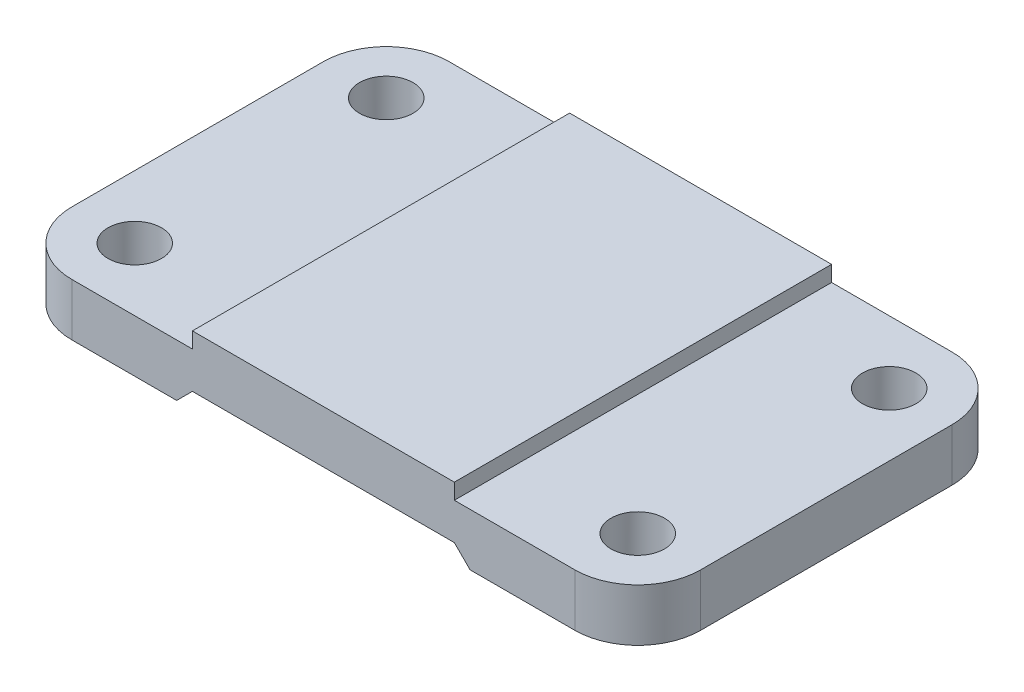
ISO-10303-21;
HEADER;
FILE_DESCRIPTION(('STEP AP214'),'2;1');
FILE_NAME('part.step','',(''),(''),'','','');
FILE_SCHEMA(('AUTOMOTIVE_DESIGN { 1 0 10303 214 1 1 1 1 }'));
ENDSEC;
DATA;
#1=APPLICATION_CONTEXT('core data for automotive mechanical design processes');
#2=APPLICATION_PROTOCOL_DEFINITION('international standard','automotive_design',2000,#1);
#3=PRODUCT_CONTEXT('',#1,'mechanical');
#4=PRODUCT('Part','Part','',(#3));
#5=PRODUCT_RELATED_PRODUCT_CATEGORY('part','',(#4));
#6=PRODUCT_DEFINITION_FORMATION('','',#4);
#7=PRODUCT_DEFINITION_CONTEXT('part definition',#1,'design');
#8=PRODUCT_DEFINITION('design','',#6,#7);
#9=PRODUCT_DEFINITION_SHAPE('','',#8);
#10=(LENGTH_UNIT() NAMED_UNIT(*) SI_UNIT(.MILLI.,.METRE.));
#11=(NAMED_UNIT(*) PLANE_ANGLE_UNIT() SI_UNIT($,.RADIAN.));
#12=(NAMED_UNIT(*) SI_UNIT($,.STERADIAN.) SOLID_ANGLE_UNIT());
#13=UNCERTAINTY_MEASURE_WITH_UNIT(LENGTH_MEASURE(1.E-05),#10,'distance_accuracy_value','');
#14=(GEOMETRIC_REPRESENTATION_CONTEXT(3) GLOBAL_UNCERTAINTY_ASSIGNED_CONTEXT((#13)) GLOBAL_UNIT_ASSIGNED_CONTEXT((#10,
#11,#12)) REPRESENTATION_CONTEXT('',''));
#15=CARTESIAN_POINT('',(0.,0.,0.));
#16=DIRECTION('',(0.,0.,1.));
#17=DIRECTION('',(1.,0.,0.));
#18=AXIS2_PLACEMENT_3D('',#15,#16,#17);
#19=CARTESIAN_POINT('',(-25.,10.,-36.));
#20=DIRECTION('',(1.,0.,0.));
#21=DIRECTION('',(0.,0.,-1.));
#22=AXIS2_PLACEMENT_3D('',#19,#20,#21);
#23=PLANE('',#22);
#24=DIRECTION('',(0.,0.,-1.));
#25=VECTOR('',#24,1.);
#26=CARTESIAN_POINT('',(-25.,7.,36.));
#27=LINE('',#26,#25);
#28=CARTESIAN_POINT('',(-25.,7.,36.));
#29=VERTEX_POINT('',#28);
#30=CARTESIAN_POINT('',(-25.,7.,-36.));
#31=VERTEX_POINT('',#30);
#32=EDGE_CURVE('E211',#29,#31,#27,.T.);
#33=ORIENTED_EDGE('',*,*,#32,.F.);
#34=DIRECTION('',(0.,-1.,0.));
#35=VECTOR('',#34,1.);
#36=CARTESIAN_POINT('',(-25.,10.,36.));
#37=LINE('',#36,#35);
#38=CARTESIAN_POINT('',(-25.,10.,36.));
#39=VERTEX_POINT('',#38);
#40=EDGE_CURVE('E263',#39,#29,#37,.T.);
#41=ORIENTED_EDGE('',*,*,#40,.F.);
#42=DIRECTION('',(0.,0.,1.));
#43=VECTOR('',#42,1.);
#44=CARTESIAN_POINT('',(-25.,10.,-36.));
#45=LINE('',#44,#43);
#46=CARTESIAN_POINT('',(-25.,10.,-36.));
#47=VERTEX_POINT('',#46);
#48=EDGE_CURVE('E260',#47,#39,#45,.T.);
#49=ORIENTED_EDGE('',*,*,#48,.F.);
#50=DIRECTION('',(0.,-1.,0.));
#51=VECTOR('',#50,1.);
#52=CARTESIAN_POINT('',(-25.,10.,-36.));
#53=LINE('',#52,#51);
#54=EDGE_CURVE('E278',#47,#31,#53,.T.);
#55=ORIENTED_EDGE('',*,*,#54,.T.);
#56=EDGE_LOOP('',(#33,#41,#49,#55));
#57=FACE_BOUND('',#56,.T.);
#58=ADVANCED_FACE('F45',(#57),#23,.F.);
#59=CARTESIAN_POINT('',(-25.,10.,36.));
#60=DIRECTION('',(0.,0.,-1.));
#61=DIRECTION('',(-1.,0.,0.));
#62=AXIS2_PLACEMENT_3D('',#59,#60,#61);
#63=PLANE('',#62);
#64=DIRECTION('',(1.,0.,0.));
#65=VECTOR('',#64,1.);
#66=CARTESIAN_POINT('',(60.,-3.00000000000001,36.));
#67=LINE('',#66,#65);
#68=CARTESIAN_POINT('',(28.,-3.00000000000001,36.));
#69=VERTEX_POINT('',#68);
#70=CARTESIAN_POINT('',(48.,-3.00000000000001,36.));
#71=VERTEX_POINT('',#70);
#72=EDGE_CURVE('E245',#69,#71,#67,.T.);
#73=ORIENTED_EDGE('',*,*,#72,.T.);
#74=DIRECTION('',(0.,1.,0.));
#75=VECTOR('',#74,1.);
#76=CARTESIAN_POINT('',(48.,10.,36.));
#77=LINE('',#76,#75);
#78=CARTESIAN_POINT('',(48.,7.,36.));
#79=VERTEX_POINT('',#78);
#80=EDGE_CURVE('E11',#71,#79,#77,.T.);
#81=ORIENTED_EDGE('',*,*,#80,.T.);
#82=DIRECTION('',(-1.,0.,0.));
#83=VECTOR('',#82,1.);
#84=CARTESIAN_POINT('',(25.,7.,36.));
#85=LINE('',#84,#83);
#86=CARTESIAN_POINT('',(25.,7.,36.));
#87=VERTEX_POINT('',#86);
#88=EDGE_CURVE('E233',#79,#87,#85,.T.);
#89=ORIENTED_EDGE('',*,*,#88,.T.);
#90=DIRECTION('',(0.,-1.,0.));
#91=VECTOR('',#90,1.);
#92=CARTESIAN_POINT('',(25.,10.,36.));
#93=LINE('',#92,#91);
#94=CARTESIAN_POINT('',(25.,10.,36.));
#95=VERTEX_POINT('',#94);
#96=EDGE_CURVE('E285',#95,#87,#93,.T.);
#97=ORIENTED_EDGE('',*,*,#96,.F.);
#98=DIRECTION('',(1.,0.,0.));
#99=VECTOR('',#98,1.);
#100=CARTESIAN_POINT('',(-25.,10.,36.));
#101=LINE('',#100,#99);
#102=EDGE_CURVE('E250',#39,#95,#101,.T.);
#103=ORIENTED_EDGE('',*,*,#102,.F.);
#104=ORIENTED_EDGE('',*,*,#40,.T.);
#105=DIRECTION('',(-1.,0.,0.));
#106=VECTOR('',#105,1.);
#107=CARTESIAN_POINT('',(-25.,7.,36.));
#108=LINE('',#107,#106);
#109=CARTESIAN_POINT('',(-48.,7.,36.));
#110=VERTEX_POINT('',#109);
#111=EDGE_CURVE('E176',#29,#110,#108,.T.);
#112=ORIENTED_EDGE('',*,*,#111,.T.);
#113=DIRECTION('',(0.,-1.,0.));
#114=VECTOR('',#113,1.);
#115=CARTESIAN_POINT('',(-48.,10.,36.));
#116=LINE('',#115,#114);
#117=CARTESIAN_POINT('',(-48.,-3.00000000000001,36.));
#118=VERTEX_POINT('',#117);
#119=EDGE_CURVE('E173',#110,#118,#116,.T.);
#120=ORIENTED_EDGE('',*,*,#119,.T.);
#121=DIRECTION('',(1.,0.,0.));
#122=VECTOR('',#121,1.);
#123=CARTESIAN_POINT('',(-60.,-3.00000000000001,36.));
#124=LINE('',#123,#122);
#125=CARTESIAN_POINT('',(-28.,-3.00000000000001,36.));
#126=VERTEX_POINT('',#125);
#127=EDGE_CURVE('E164',#118,#126,#124,.T.);
#128=ORIENTED_EDGE('',*,*,#127,.T.);
#129=DIRECTION('',(0.707106781186546,0.707106781186549,0.));
#130=VECTOR('',#129,1.);
#131=CARTESIAN_POINT('',(-28.,-3.00000000000001,36.));
#132=LINE('',#131,#130);
#133=CARTESIAN_POINT('',(-25.,0.,36.));
#134=VERTEX_POINT('',#133);
#135=EDGE_CURVE('E169',#126,#134,#132,.T.);
#136=ORIENTED_EDGE('',*,*,#135,.T.);
#137=DIRECTION('',(1.,0.,0.));
#138=VECTOR('',#137,1.);
#139=CARTESIAN_POINT('',(-25.,0.,36.));
#140=LINE('',#139,#138);
#141=CARTESIAN_POINT('',(25.,0.,36.));
#142=VERTEX_POINT('',#141);
#143=EDGE_CURVE('E215',#134,#142,#140,.T.);
#144=ORIENTED_EDGE('',*,*,#143,.T.);
#145=DIRECTION('',(0.707106781186547,-0.707106781186548,0.));
#146=VECTOR('',#145,1.);
#147=CARTESIAN_POINT('',(25.,0.,36.));
#148=LINE('',#147,#146);
#149=EDGE_CURVE('E238',#142,#69,#148,.T.);
#150=ORIENTED_EDGE('',*,*,#149,.T.);
#151=EDGE_LOOP('',(#73,#81,#89,#97,#103,#104,#112,#120,#128,#136,#144,#150));
#152=FACE_BOUND('',#151,.T.);
#153=ADVANCED_FACE('F166',(#152),#63,.F.);
#154=CARTESIAN_POINT('',(25.,10.,36.));
#155=DIRECTION('',(-1.,0.,0.));
#156=DIRECTION('',(0.,0.,1.));
#157=AXIS2_PLACEMENT_3D('',#154,#155,#156);
#158=PLANE('',#157);
#159=ORIENTED_EDGE('',*,*,#96,.T.);
#160=DIRECTION('',(0.,0.,-1.));
#161=VECTOR('',#160,1.);
#162=CARTESIAN_POINT('',(25.,7.,36.));
#163=LINE('',#162,#161);
#164=CARTESIAN_POINT('',(25.,7.,-36.));
#165=VERTEX_POINT('',#164);
#166=EDGE_CURVE('E229',#87,#165,#163,.T.);
#167=ORIENTED_EDGE('',*,*,#166,.T.);
#168=DIRECTION('',(0.,-1.,0.));
#169=VECTOR('',#168,1.);
#170=CARTESIAN_POINT('',(25.,10.,-36.));
#171=LINE('',#170,#169);
#172=CARTESIAN_POINT('',(25.,10.,-36.));
#173=VERTEX_POINT('',#172);
#174=EDGE_CURVE('E281',#173,#165,#171,.T.);
#175=ORIENTED_EDGE('',*,*,#174,.F.);
#176=DIRECTION('',(0.,0.,-1.));
#177=VECTOR('',#176,1.);
#178=CARTESIAN_POINT('',(25.,10.,36.));
#179=LINE('',#178,#177);
#180=EDGE_CURVE('E254',#95,#173,#179,.T.);
#181=ORIENTED_EDGE('',*,*,#180,.F.);
#182=EDGE_LOOP('',(#159,#167,#175,#181));
#183=FACE_BOUND('',#182,.T.);
#184=ADVANCED_FACE('F367',(#183),#158,.F.);
#185=CARTESIAN_POINT('',(25.,10.,-36.));
#186=DIRECTION('',(0.,0.,1.));
#187=DIRECTION('',(1.,0.,0.));
#188=AXIS2_PLACEMENT_3D('',#185,#186,#187);
#189=PLANE('',#188);
#190=DIRECTION('',(-1.,0.,0.));
#191=VECTOR('',#190,1.);
#192=CARTESIAN_POINT('',(25.,7.,-36.));
#193=LINE('',#192,#191);
#194=CARTESIAN_POINT('',(48.,7.,-36.));
#195=VERTEX_POINT('',#194);
#196=EDGE_CURVE('E234',#195,#165,#193,.T.);
#197=ORIENTED_EDGE('',*,*,#196,.F.);
#198=DIRECTION('',(0.,1.,0.));
#199=VECTOR('',#198,1.);
#200=CARTESIAN_POINT('',(48.,10.,-36.));
#201=LINE('',#200,#199);
#202=CARTESIAN_POINT('',(48.,-3.00000000000001,-36.));
#203=VERTEX_POINT('',#202);
#204=EDGE_CURVE('E69',#195,#203,#201,.F.);
#205=ORIENTED_EDGE('',*,*,#204,.T.);
#206=DIRECTION('',(1.,0.,0.));
#207=VECTOR('',#206,1.);
#208=CARTESIAN_POINT('',(60.,-3.00000000000001,-36.));
#209=LINE('',#208,#207);
#210=CARTESIAN_POINT('',(28.,-3.00000000000001,-36.));
#211=VERTEX_POINT('',#210);
#212=EDGE_CURVE('E237',#211,#203,#209,.T.);
#213=ORIENTED_EDGE('',*,*,#212,.F.);
#214=DIRECTION('',(0.707106781186547,-0.707106781186548,0.));
#215=VECTOR('',#214,1.);
#216=CARTESIAN_POINT('',(25.,0.,-36.));
#217=LINE('',#216,#215);
#218=CARTESIAN_POINT('',(25.,0.,-36.));
#219=VERTEX_POINT('',#218);
#220=EDGE_CURVE('E200',#219,#211,#217,.T.);
#221=ORIENTED_EDGE('',*,*,#220,.F.);
#222=DIRECTION('',(-1.,0.,0.));
#223=VECTOR('',#222,1.);
#224=CARTESIAN_POINT('',(25.,0.,-36.));
#225=LINE('',#224,#223);
#226=CARTESIAN_POINT('',(-25.,0.,-36.));
#227=VERTEX_POINT('',#226);
#228=EDGE_CURVE('E270',#219,#227,#225,.T.);
#229=ORIENTED_EDGE('',*,*,#228,.T.);
#230=DIRECTION('',(0.707106781186546,0.707106781186549,0.));
#231=VECTOR('',#230,1.);
#232=CARTESIAN_POINT('',(-28.,-3.00000000000001,-36.));
#233=LINE('',#232,#231);
#234=CARTESIAN_POINT('',(-28.,-3.00000000000001,-36.));
#235=VERTEX_POINT('',#234);
#236=EDGE_CURVE('E203',#235,#227,#233,.T.);
#237=ORIENTED_EDGE('',*,*,#236,.F.);
#238=DIRECTION('',(1.,0.,0.));
#239=VECTOR('',#238,1.);
#240=CARTESIAN_POINT('',(-60.,-3.00000000000001,-36.));
#241=LINE('',#240,#239);
#242=CARTESIAN_POINT('',(-48.,-3.00000000000001,-36.));
#243=VERTEX_POINT('',#242);
#244=EDGE_CURVE('E182',#243,#235,#241,.T.);
#245=ORIENTED_EDGE('',*,*,#244,.F.);
#246=DIRECTION('',(0.,-1.,0.));
#247=VECTOR('',#246,1.);
#248=CARTESIAN_POINT('',(-48.,10.,-36.));
#249=LINE('',#248,#247);
#250=CARTESIAN_POINT('',(-48.,7.,-36.));
#251=VERTEX_POINT('',#250);
#252=EDGE_CURVE('E315',#243,#251,#249,.F.);
#253=ORIENTED_EDGE('',*,*,#252,.T.);
#254=DIRECTION('',(-1.,0.,0.));
#255=VECTOR('',#254,1.);
#256=CARTESIAN_POINT('',(-25.,7.,-36.));
#257=LINE('',#256,#255);
#258=EDGE_CURVE('E196',#31,#251,#257,.T.);
#259=ORIENTED_EDGE('',*,*,#258,.F.);
#260=ORIENTED_EDGE('',*,*,#54,.F.);
#261=DIRECTION('',(-1.,0.,0.));
#262=VECTOR('',#261,1.);
#263=CARTESIAN_POINT('',(25.,10.,-36.));
#264=LINE('',#263,#262);
#265=EDGE_CURVE('E257',#173,#47,#264,.T.);
#266=ORIENTED_EDGE('',*,*,#265,.F.);
#267=ORIENTED_EDGE('',*,*,#174,.T.);
#268=EDGE_LOOP('',(#197,#205,#213,#221,#229,#237,#245,#253,#259,#260,#266,#267));
#269=FACE_BOUND('',#268,.T.);
#270=ADVANCED_FACE('F362',(#269),#189,.F.);
#271=CARTESIAN_POINT('',(0.,10.,0.));
#272=DIRECTION('',(0.,1.,0.));
#273=DIRECTION('',(0.,0.,1.));
#274=AXIS2_PLACEMENT_3D('',#271,#272,#273);
#275=PLANE('',#274);
#276=ORIENTED_EDGE('',*,*,#102,.T.);
#277=ORIENTED_EDGE('',*,*,#180,.T.);
#278=ORIENTED_EDGE('',*,*,#265,.T.);
#279=ORIENTED_EDGE('',*,*,#48,.T.);
#280=EDGE_LOOP('',(#276,#277,#278,#279));
#281=FACE_BOUND('',#280,.T.);
#282=ADVANCED_FACE('F393',(#281),#275,.T.);
#283=CARTESIAN_POINT('',(0.,0.,0.));
#284=DIRECTION('',(0.,1.,0.));
#285=DIRECTION('',(0.,0.,1.));
#286=AXIS2_PLACEMENT_3D('',#283,#284,#285);
#287=PLANE('',#286);
#288=ORIENTED_EDGE('',*,*,#143,.F.);
#289=DIRECTION('',(0.,0.,1.));
#290=VECTOR('',#289,1.);
#291=CARTESIAN_POINT('',(-25.,0.,-36.));
#292=LINE('',#291,#290);
#293=EDGE_CURVE('E191',#227,#134,#292,.T.);
#294=ORIENTED_EDGE('',*,*,#293,.F.);
#295=ORIENTED_EDGE('',*,*,#228,.F.);
#296=DIRECTION('',(0.,0.,-1.));
#297=VECTOR('',#296,1.);
#298=CARTESIAN_POINT('',(25.,0.,36.));
#299=LINE('',#298,#297);
#300=EDGE_CURVE('E266',#142,#219,#299,.T.);
#301=ORIENTED_EDGE('',*,*,#300,.F.);
#302=EDGE_LOOP('',(#288,#294,#295,#301));
#303=FACE_BOUND('',#302,.T.);
#304=ADVANCED_FACE('F389',(#303),#287,.F.);
#305=CARTESIAN_POINT('',(-25.,7.,36.));
#306=DIRECTION('',(0.,-1.,0.));
#307=DIRECTION('',(1.,0.,0.));
#308=AXIS2_PLACEMENT_3D('',#305,#306,#307);
#309=PLANE('',#308);
#310=CARTESIAN_POINT('',(-48.,7.,24.));
#311=DIRECTION('',(0.,-1.,0.));
#312=DIRECTION('',(1.,0.,0.));
#313=AXIS2_PLACEMENT_3D('',#310,#311,#312);
#314=CIRCLE('',#313,5.1);
#315=CARTESIAN_POINT('',(-42.9,7.,24.));
#316=VERTEX_POINT('',#315);
#317=EDGE_CURVE('E221',#316,#316,#314,.T.);
#318=ORIENTED_EDGE('',*,*,#317,.T.);
#319=EDGE_LOOP('',(#318));
#320=FACE_BOUND('',#319,.T.);
#321=CARTESIAN_POINT('',(-48.,7.,-24.));
#322=DIRECTION('',(0.,-1.,0.));
#323=DIRECTION('',(1.,0.,0.));
#324=AXIS2_PLACEMENT_3D('',#321,#322,#323);
#325=CIRCLE('',#324,5.1);
#326=CARTESIAN_POINT('',(-42.9,7.,-24.));
#327=VERTEX_POINT('',#326);
#328=EDGE_CURVE('E304',#327,#327,#325,.T.);
#329=ORIENTED_EDGE('',*,*,#328,.T.);
#330=EDGE_LOOP('',(#329));
#331=FACE_BOUND('',#330,.T.);
#332=DIRECTION('',(0.,0.,-1.));
#333=VECTOR('',#332,1.);
#334=CARTESIAN_POINT('',(-60.,7.,36.));
#335=LINE('',#334,#333);
#336=CARTESIAN_POINT('',(-60.,7.,24.));
#337=VERTEX_POINT('',#336);
#338=CARTESIAN_POINT('',(-60.,7.,-24.));
#339=VERTEX_POINT('',#338);
#340=EDGE_CURVE('E208',#337,#339,#335,.T.);
#341=ORIENTED_EDGE('',*,*,#340,.F.);
#342=CARTESIAN_POINT('',(-48.,7.,24.));
#343=DIRECTION('',(0.,-1.,0.));
#344=DIRECTION('',(1.,0.,0.));
#345=AXIS2_PLACEMENT_3D('',#342,#343,#344);
#346=CIRCLE('',#345,12.);
#347=EDGE_CURVE('E330',#337,#110,#346,.F.);
#348=ORIENTED_EDGE('',*,*,#347,.T.);
#349=ORIENTED_EDGE('',*,*,#111,.F.);
#350=ORIENTED_EDGE('',*,*,#32,.T.);
#351=ORIENTED_EDGE('',*,*,#258,.T.);
#352=CARTESIAN_POINT('',(-48.,7.,-24.));
#353=DIRECTION('',(0.,-1.,0.));
#354=DIRECTION('',(1.,0.,0.));
#355=AXIS2_PLACEMENT_3D('',#352,#353,#354);
#356=CIRCLE('',#355,12.);
#357=EDGE_CURVE('E318',#251,#339,#356,.F.);
#358=ORIENTED_EDGE('',*,*,#357,.T.);
#359=EDGE_LOOP('',(#341,#348,#349,#350,#351,#358));
#360=FACE_BOUND('',#359,.T.);
#361=ADVANCED_FACE('F410',(#320,#331,#360),#309,.F.);
#362=CARTESIAN_POINT('',(-60.,7.,36.));
#363=DIRECTION('',(1.,0.,0.));
#364=DIRECTION('',(0.,0.,-1.));
#365=AXIS2_PLACEMENT_3D('',#362,#363,#364);
#366=PLANE('',#365);
#367=DIRECTION('',(0.,0.,-1.));
#368=VECTOR('',#367,1.);
#369=CARTESIAN_POINT('',(-60.,-3.00000000000001,36.));
#370=LINE('',#369,#368);
#371=CARTESIAN_POINT('',(-60.,-3.00000000000001,24.));
#372=VERTEX_POINT('',#371);
#373=CARTESIAN_POINT('',(-60.,-3.00000000000001,-24.));
#374=VERTEX_POINT('',#373);
#375=EDGE_CURVE('E187',#372,#374,#370,.T.);
#376=ORIENTED_EDGE('',*,*,#375,.F.);
#377=DIRECTION('',(0.,-1.,0.));
#378=VECTOR('',#377,1.);
#379=CARTESIAN_POINT('',(-60.,7.,24.));
#380=LINE('',#379,#378);
#381=EDGE_CURVE('E327',#372,#337,#380,.F.);
#382=ORIENTED_EDGE('',*,*,#381,.T.);
#383=ORIENTED_EDGE('',*,*,#340,.T.);
#384=DIRECTION('',(0.,-1.,0.));
#385=VECTOR('',#384,1.);
#386=CARTESIAN_POINT('',(-60.,7.,-24.));
#387=LINE('',#386,#385);
#388=EDGE_CURVE('E289',#339,#374,#387,.T.);
#389=ORIENTED_EDGE('',*,*,#388,.T.);
#390=EDGE_LOOP('',(#376,#382,#383,#389));
#391=FACE_BOUND('',#390,.T.);
#392=ADVANCED_FACE('F455',(#391),#366,.F.);
#393=CARTESIAN_POINT('',(-60.,-3.00000000000001,36.));
#394=DIRECTION('',(0.,1.,0.));
#395=DIRECTION('',(-1.,0.,0.));
#396=AXIS2_PLACEMENT_3D('',#393,#394,#395);
#397=PLANE('',#396);
#398=CARTESIAN_POINT('',(-48.,-3.,24.));
#399=DIRECTION('',(0.,1.,0.));
#400=DIRECTION('',(-1.,0.,0.));
#401=AXIS2_PLACEMENT_3D('',#398,#399,#400);
#402=CIRCLE('',#401,5.1);
#403=CARTESIAN_POINT('',(-53.1,-3.,24.));
#404=VERTEX_POINT('',#403);
#405=EDGE_CURVE('E305',#404,#404,#402,.T.);
#406=ORIENTED_EDGE('',*,*,#405,.T.);
#407=EDGE_LOOP('',(#406));
#408=FACE_BOUND('',#407,.T.);
#409=CARTESIAN_POINT('',(-48.,-3.,-24.));
#410=DIRECTION('',(0.,1.,0.));
#411=DIRECTION('',(-1.,0.,0.));
#412=AXIS2_PLACEMENT_3D('',#409,#410,#411);
#413=CIRCLE('',#412,5.1);
#414=CARTESIAN_POINT('',(-53.1,-3.,-24.));
#415=VERTEX_POINT('',#414);
#416=EDGE_CURVE('E300',#415,#415,#413,.T.);
#417=ORIENTED_EDGE('',*,*,#416,.T.);
#418=EDGE_LOOP('',(#417));
#419=FACE_BOUND('',#418,.T.);
#420=ORIENTED_EDGE('',*,*,#127,.F.);
#421=CARTESIAN_POINT('',(-48.,-3.,24.));
#422=DIRECTION('',(0.,1.,0.));
#423=DIRECTION('',(-1.,0.,0.));
#424=AXIS2_PLACEMENT_3D('',#421,#422,#423);
#425=CIRCLE('',#424,12.);
#426=EDGE_CURVE('E324',#118,#372,#425,.F.);
#427=ORIENTED_EDGE('',*,*,#426,.T.);
#428=ORIENTED_EDGE('',*,*,#375,.T.);
#429=CARTESIAN_POINT('',(-48.,-3.00000000000001,-24.));
#430=DIRECTION('',(0.,1.,0.));
#431=DIRECTION('',(-1.,0.,0.));
#432=AXIS2_PLACEMENT_3D('',#429,#430,#431);
#433=CIRCLE('',#432,12.);
#434=EDGE_CURVE('E312',#374,#243,#433,.F.);
#435=ORIENTED_EDGE('',*,*,#434,.T.);
#436=ORIENTED_EDGE('',*,*,#244,.T.);
#437=DIRECTION('',(0.,0.,-1.));
#438=VECTOR('',#437,1.);
#439=CARTESIAN_POINT('',(-28.,-3.00000000000001,36.));
#440=LINE('',#439,#438);
#441=EDGE_CURVE('E179',#126,#235,#440,.T.);
#442=ORIENTED_EDGE('',*,*,#441,.F.);
#443=EDGE_LOOP('',(#420,#427,#428,#435,#436,#442));
#444=FACE_BOUND('',#443,.T.);
#445=ADVANCED_FACE('F180',(#408,#419,#444),#397,.F.);
#446=CARTESIAN_POINT('',(-28.,-3.00000000000001,36.));
#447=DIRECTION('',(-0.707106781186549,0.707106781186546,0.));
#448=DIRECTION('',(-0.707106781186546,-0.707106781186549,0.));
#449=AXIS2_PLACEMENT_3D('',#446,#447,#448);
#450=PLANE('',#449);
#451=ORIENTED_EDGE('',*,*,#236,.T.);
#452=ORIENTED_EDGE('',*,*,#293,.T.);
#453=ORIENTED_EDGE('',*,*,#135,.F.);
#454=ORIENTED_EDGE('',*,*,#441,.T.);
#455=EDGE_LOOP('',(#451,#452,#453,#454));
#456=FACE_BOUND('',#455,.T.);
#457=ADVANCED_FACE('F189',(#456),#450,.F.);
#458=CARTESIAN_POINT('',(25.,0.,36.));
#459=DIRECTION('',(0.707106781186548,0.707106781186547,0.));
#460=DIRECTION('',(-0.707106781186547,0.707106781186548,0.));
#461=AXIS2_PLACEMENT_3D('',#458,#459,#460);
#462=PLANE('',#461);
#463=ORIENTED_EDGE('',*,*,#220,.T.);
#464=DIRECTION('',(0.,0.,-1.));
#465=VECTOR('',#464,1.);
#466=CARTESIAN_POINT('',(28.,-3.00000000000001,36.));
#467=LINE('',#466,#465);
#468=EDGE_CURVE('E216',#69,#211,#467,.T.);
#469=ORIENTED_EDGE('',*,*,#468,.F.);
#470=ORIENTED_EDGE('',*,*,#149,.F.);
#471=ORIENTED_EDGE('',*,*,#300,.T.);
#472=EDGE_LOOP('',(#463,#469,#470,#471));
#473=FACE_BOUND('',#472,.T.);
#474=ADVANCED_FACE('F453',(#473),#462,.F.);
#475=CARTESIAN_POINT('',(60.,-3.00000000000001,36.));
#476=DIRECTION('',(0.,1.,0.));
#477=DIRECTION('',(-1.,0.,0.));
#478=AXIS2_PLACEMENT_3D('',#475,#476,#477);
#479=PLANE('',#478);
#480=CARTESIAN_POINT('',(48.,-3.00000000000001,-24.));
#481=DIRECTION('',(0.,1.,0.));
#482=DIRECTION('',(-1.,0.,0.));
#483=AXIS2_PLACEMENT_3D('',#480,#481,#482);
#484=CIRCLE('',#483,5.1);
#485=CARTESIAN_POINT('',(42.9,-3.00000000000001,-24.));
#486=VERTEX_POINT('',#485);
#487=EDGE_CURVE('E299',#486,#486,#484,.T.);
#488=ORIENTED_EDGE('',*,*,#487,.T.);
#489=EDGE_LOOP('',(#488));
#490=FACE_BOUND('',#489,.T.);
#491=CARTESIAN_POINT('',(48.,-3.00000000000001,24.));
#492=DIRECTION('',(0.,1.,0.));
#493=DIRECTION('',(-1.,0.,0.));
#494=AXIS2_PLACEMENT_3D('',#491,#492,#493);
#495=CIRCLE('',#494,5.1);
#496=CARTESIAN_POINT('',(42.9,-3.00000000000001,24.));
#497=VERTEX_POINT('',#496);
#498=EDGE_CURVE('E294',#497,#497,#495,.T.);
#499=ORIENTED_EDGE('',*,*,#498,.T.);
#500=EDGE_LOOP('',(#499));
#501=FACE_BOUND('',#500,.T.);
#502=ORIENTED_EDGE('',*,*,#212,.T.);
#503=CARTESIAN_POINT('',(48.,-3.00000000000001,-24.));
#504=DIRECTION('',(0.,1.,0.));
#505=DIRECTION('',(-1.,0.,0.));
#506=AXIS2_PLACEMENT_3D('',#503,#504,#505);
#507=CIRCLE('',#506,12.);
#508=CARTESIAN_POINT('',(60.,-3.00000000000001,-24.));
#509=VERTEX_POINT('',#508);
#510=EDGE_CURVE('E54',#203,#509,#507,.F.);
#511=ORIENTED_EDGE('',*,*,#510,.T.);
#512=DIRECTION('',(0.,0.,-1.));
#513=VECTOR('',#512,1.);
#514=CARTESIAN_POINT('',(60.,-3.00000000000001,36.));
#515=LINE('',#514,#513);
#516=CARTESIAN_POINT('',(60.,-3.00000000000001,24.));
#517=VERTEX_POINT('',#516);
#518=EDGE_CURVE('E220',#517,#509,#515,.T.);
#519=ORIENTED_EDGE('',*,*,#518,.F.);
#520=CARTESIAN_POINT('',(48.,-3.00000000000001,24.));
#521=DIRECTION('',(0.,1.,0.));
#522=DIRECTION('',(-1.,0.,0.));
#523=AXIS2_PLACEMENT_3D('',#520,#521,#522);
#524=CIRCLE('',#523,12.);
#525=EDGE_CURVE('E61',#517,#71,#524,.F.);
#526=ORIENTED_EDGE('',*,*,#525,.T.);
#527=ORIENTED_EDGE('',*,*,#72,.F.);
#528=ORIENTED_EDGE('',*,*,#468,.T.);
#529=EDGE_LOOP('',(#502,#511,#519,#526,#527,#528));
#530=FACE_BOUND('',#529,.T.);
#531=ADVANCED_FACE('F351',(#490,#501,#530),#479,.F.);
#532=CARTESIAN_POINT('',(60.,7.00000000000001,36.));
#533=DIRECTION('',(-1.,0.,0.));
#534=DIRECTION('',(0.,0.,1.));
#535=AXIS2_PLACEMENT_3D('',#532,#533,#534);
#536=PLANE('',#535);
#537=ORIENTED_EDGE('',*,*,#518,.T.);
#538=DIRECTION('',(0.,1.,0.));
#539=VECTOR('',#538,1.);
#540=CARTESIAN_POINT('',(60.,7.00000000000001,-24.));
#541=LINE('',#540,#539);
#542=CARTESIAN_POINT('',(60.,7.00000000000001,-24.));
#543=VERTEX_POINT('',#542);
#544=EDGE_CURVE('E336',#509,#543,#541,.T.);
#545=ORIENTED_EDGE('',*,*,#544,.T.);
#546=DIRECTION('',(0.,0.,-1.));
#547=VECTOR('',#546,1.);
#548=CARTESIAN_POINT('',(60.,7.00000000000001,36.));
#549=LINE('',#548,#547);
#550=CARTESIAN_POINT('',(60.,7.00000000000001,24.));
#551=VERTEX_POINT('',#550);
#552=EDGE_CURVE('E225',#551,#543,#549,.T.);
#553=ORIENTED_EDGE('',*,*,#552,.F.);
#554=DIRECTION('',(0.,1.,0.));
#555=VECTOR('',#554,1.);
#556=CARTESIAN_POINT('',(60.,7.00000000000001,24.));
#557=LINE('',#556,#555);
#558=EDGE_CURVE('E333',#551,#517,#557,.F.);
#559=ORIENTED_EDGE('',*,*,#558,.T.);
#560=EDGE_LOOP('',(#537,#545,#553,#559));
#561=FACE_BOUND('',#560,.T.);
#562=ADVANCED_FACE('F355',(#561),#536,.F.);
#563=CARTESIAN_POINT('',(25.,7.,36.));
#564=DIRECTION('',(0.,-1.,0.));
#565=DIRECTION('',(1.,0.,0.));
#566=AXIS2_PLACEMENT_3D('',#563,#564,#565);
#567=PLANE('',#566);
#568=CARTESIAN_POINT('',(48.,7.,-24.));
#569=DIRECTION('',(0.,-1.,0.));
#570=DIRECTION('',(1.,0.,0.));
#571=AXIS2_PLACEMENT_3D('',#568,#569,#570);
#572=CIRCLE('',#571,5.1);
#573=CARTESIAN_POINT('',(53.1,7.,-24.));
#574=VERTEX_POINT('',#573);
#575=EDGE_CURVE('E295',#574,#574,#572,.T.);
#576=ORIENTED_EDGE('',*,*,#575,.T.);
#577=EDGE_LOOP('',(#576));
#578=FACE_BOUND('',#577,.T.);
#579=CARTESIAN_POINT('',(48.,7.,24.));
#580=DIRECTION('',(0.,-1.,0.));
#581=DIRECTION('',(1.,0.,0.));
#582=AXIS2_PLACEMENT_3D('',#579,#580,#581);
#583=CIRCLE('',#582,5.1);
#584=CARTESIAN_POINT('',(53.1,7.,24.));
#585=VERTEX_POINT('',#584);
#586=EDGE_CURVE('E290',#585,#585,#583,.T.);
#587=ORIENTED_EDGE('',*,*,#586,.T.);
#588=EDGE_LOOP('',(#587));
#589=FACE_BOUND('',#588,.T.);
#590=ORIENTED_EDGE('',*,*,#552,.T.);
#591=CARTESIAN_POINT('',(48.,7.,-24.));
#592=DIRECTION('',(0.,-1.,0.));
#593=DIRECTION('',(1.,0.,0.));
#594=AXIS2_PLACEMENT_3D('',#591,#592,#593);
#595=CIRCLE('',#594,12.);
#596=EDGE_CURVE('E343',#543,#195,#595,.F.);
#597=ORIENTED_EDGE('',*,*,#596,.T.);
#598=ORIENTED_EDGE('',*,*,#196,.T.);
#599=ORIENTED_EDGE('',*,*,#166,.F.);
#600=ORIENTED_EDGE('',*,*,#88,.F.);
#601=CARTESIAN_POINT('',(48.,7.,24.));
#602=DIRECTION('',(0.,-1.,0.));
#603=DIRECTION('',(1.,0.,0.));
#604=AXIS2_PLACEMENT_3D('',#601,#602,#603);
#605=CIRCLE('',#604,12.);
#606=EDGE_CURVE('E340',#79,#551,#605,.F.);
#607=ORIENTED_EDGE('',*,*,#606,.T.);
#608=EDGE_LOOP('',(#590,#597,#598,#599,#600,#607));
#609=FACE_BOUND('',#608,.T.);
#610=ADVANCED_FACE('F360',(#578,#589,#609),#567,.F.);
#611=CARTESIAN_POINT('',(48.,-36.,24.));
#612=DIRECTION('',(0.,1.,0.));
#613=DIRECTION('',(0.,0.,1.));
#614=AXIS2_PLACEMENT_3D('',#611,#612,#613);
#615=CYLINDRICAL_SURFACE('',#614,5.1);
#616=ORIENTED_EDGE('',*,*,#586,.F.);
#617=EDGE_LOOP('',(#616));
#618=FACE_BOUND('',#617,.T.);
#619=ORIENTED_EDGE('',*,*,#498,.F.);
#620=EDGE_LOOP('',(#619));
#621=FACE_BOUND('',#620,.T.);
#622=ADVANCED_FACE('F428',(#618,#621),#615,.F.);
#623=CARTESIAN_POINT('',(48.,-36.,-24.));
#624=DIRECTION('',(0.,1.,0.));
#625=DIRECTION('',(0.,0.,1.));
#626=AXIS2_PLACEMENT_3D('',#623,#624,#625);
#627=CYLINDRICAL_SURFACE('',#626,5.1);
#628=ORIENTED_EDGE('',*,*,#575,.F.);
#629=EDGE_LOOP('',(#628));
#630=FACE_BOUND('',#629,.T.);
#631=ORIENTED_EDGE('',*,*,#487,.F.);
#632=EDGE_LOOP('',(#631));
#633=FACE_BOUND('',#632,.T.);
#634=ADVANCED_FACE('F430',(#630,#633),#627,.F.);
#635=CARTESIAN_POINT('',(-48.,-36.,-24.));
#636=DIRECTION('',(0.,1.,0.));
#637=DIRECTION('',(0.,0.,1.));
#638=AXIS2_PLACEMENT_3D('',#635,#636,#637);
#639=CYLINDRICAL_SURFACE('',#638,5.1);
#640=ORIENTED_EDGE('',*,*,#416,.F.);
#641=EDGE_LOOP('',(#640));
#642=FACE_BOUND('',#641,.T.);
#643=ORIENTED_EDGE('',*,*,#328,.F.);
#644=EDGE_LOOP('',(#643));
#645=FACE_BOUND('',#644,.T.);
#646=ADVANCED_FACE('F437',(#642,#645),#639,.F.);
#647=CARTESIAN_POINT('',(-48.,-36.,24.));
#648=DIRECTION('',(0.,1.,0.));
#649=DIRECTION('',(0.,0.,1.));
#650=AXIS2_PLACEMENT_3D('',#647,#648,#649);
#651=CYLINDRICAL_SURFACE('',#650,5.1);
#652=ORIENTED_EDGE('',*,*,#405,.F.);
#653=EDGE_LOOP('',(#652));
#654=FACE_BOUND('',#653,.T.);
#655=ORIENTED_EDGE('',*,*,#317,.F.);
#656=EDGE_LOOP('',(#655));
#657=FACE_BOUND('',#656,.T.);
#658=ADVANCED_FACE('F398',(#654,#657),#651,.F.);
#659=CARTESIAN_POINT('',(-48.,7.,-24.));
#660=DIRECTION('',(0.,-1.,0.));
#661=DIRECTION('',(0.,0.,-1.));
#662=AXIS2_PLACEMENT_3D('',#659,#660,#661);
#663=CYLINDRICAL_SURFACE('',#662,12.);
#664=ORIENTED_EDGE('',*,*,#357,.F.);
#665=ORIENTED_EDGE('',*,*,#252,.F.);
#666=ORIENTED_EDGE('',*,*,#434,.F.);
#667=ORIENTED_EDGE('',*,*,#388,.F.);
#668=EDGE_LOOP('',(#664,#665,#666,#667));
#669=FACE_BOUND('',#668,.T.);
#670=ADVANCED_FACE('F395',(#669),#663,.T.);
#671=CARTESIAN_POINT('',(-48.,10.,24.));
#672=DIRECTION('',(0.,-1.,0.));
#673=DIRECTION('',(0.,0.,-1.));
#674=AXIS2_PLACEMENT_3D('',#671,#672,#673);
#675=CYLINDRICAL_SURFACE('',#674,12.);
#676=ORIENTED_EDGE('',*,*,#347,.F.);
#677=ORIENTED_EDGE('',*,*,#381,.F.);
#678=ORIENTED_EDGE('',*,*,#426,.F.);
#679=ORIENTED_EDGE('',*,*,#119,.F.);
#680=EDGE_LOOP('',(#676,#677,#678,#679));
#681=FACE_BOUND('',#680,.T.);
#682=ADVANCED_FACE('F377',(#681),#675,.T.);
#683=CARTESIAN_POINT('',(48.,7.00000000000001,-24.));
#684=DIRECTION('',(0.,1.,0.));
#685=DIRECTION('',(0.,0.,1.));
#686=AXIS2_PLACEMENT_3D('',#683,#684,#685);
#687=CYLINDRICAL_SURFACE('',#686,12.);
#688=ORIENTED_EDGE('',*,*,#510,.F.);
#689=ORIENTED_EDGE('',*,*,#204,.F.);
#690=ORIENTED_EDGE('',*,*,#596,.F.);
#691=ORIENTED_EDGE('',*,*,#544,.F.);
#692=EDGE_LOOP('',(#688,#689,#690,#691));
#693=FACE_BOUND('',#692,.T.);
#694=ADVANCED_FACE('F358',(#693),#687,.T.);
#695=CARTESIAN_POINT('',(48.,10.,24.));
#696=DIRECTION('',(0.,1.,0.));
#697=DIRECTION('',(0.,0.,1.));
#698=AXIS2_PLACEMENT_3D('',#695,#696,#697);
#699=CYLINDRICAL_SURFACE('',#698,12.);
#700=ORIENTED_EDGE('',*,*,#525,.F.);
#701=ORIENTED_EDGE('',*,*,#558,.F.);
#702=ORIENTED_EDGE('',*,*,#606,.F.);
#703=ORIENTED_EDGE('',*,*,#80,.F.);
#704=EDGE_LOOP('',(#700,#701,#702,#703));
#705=FACE_BOUND('',#704,.T.);
#706=ADVANCED_FACE('F47',(#705),#699,.T.);
#707=CLOSED_SHELL('',(#58,#153,#184,#270,#282,#304,#361,#392,#445,#457,#474,#531,#562,#610,#622,
#634,#646,#658,#670,#682,#694,#706));
#708=MANIFOLD_SOLID_BREP('B2',#707);
#709=ADVANCED_BREP_SHAPE_REPRESENTATION('',(#18,#708),#14);
#710=SHAPE_DEFINITION_REPRESENTATION(#9,#709);
ENDSEC;
END-ISO-10303-21;
